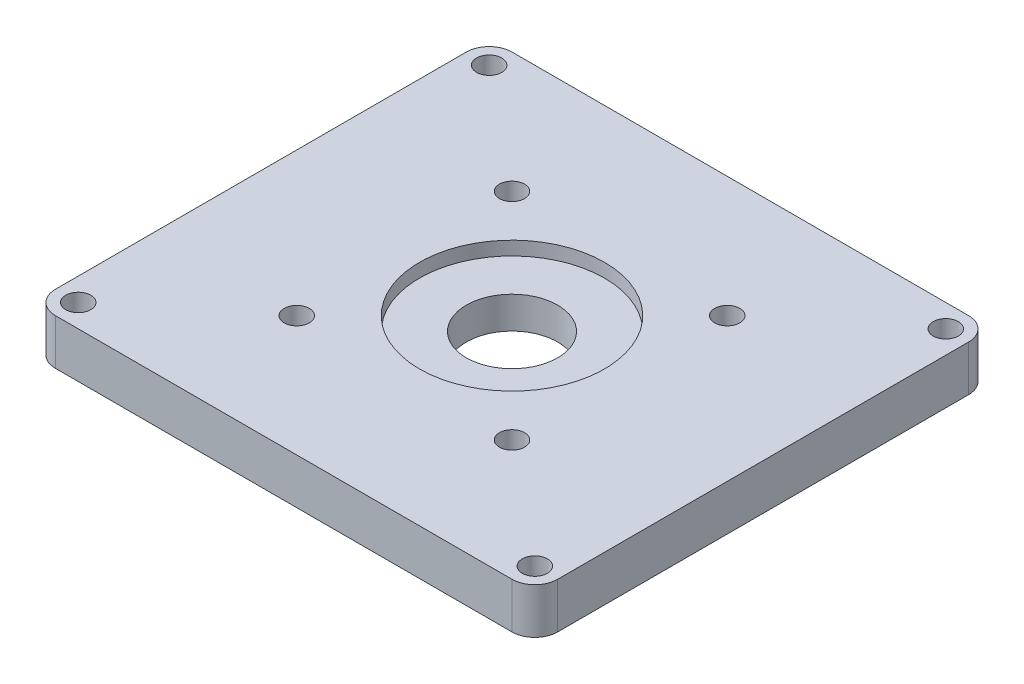
ISO-10303-21;
HEADER;
FILE_DESCRIPTION(('STEP AP214'),'2;1');
FILE_NAME('part.step','',(''),(''),'','','');
FILE_SCHEMA(('AUTOMOTIVE_DESIGN { 1 0 10303 214 1 1 1 1 }'));
ENDSEC;
DATA;
#1=APPLICATION_CONTEXT('core data for automotive mechanical design processes');
#2=APPLICATION_PROTOCOL_DEFINITION('international standard','automotive_design',2000,#1);
#3=PRODUCT_CONTEXT('',#1,'mechanical');
#4=PRODUCT('Part','Part','',(#3));
#5=PRODUCT_RELATED_PRODUCT_CATEGORY('part','',(#4));
#6=PRODUCT_DEFINITION_FORMATION('','',#4);
#7=PRODUCT_DEFINITION_CONTEXT('part definition',#1,'design');
#8=PRODUCT_DEFINITION('design','',#6,#7);
#9=PRODUCT_DEFINITION_SHAPE('','',#8);
#10=(LENGTH_UNIT() NAMED_UNIT(*) SI_UNIT(.MILLI.,.METRE.));
#11=(NAMED_UNIT(*) PLANE_ANGLE_UNIT() SI_UNIT($,.RADIAN.));
#12=(NAMED_UNIT(*) SI_UNIT($,.STERADIAN.) SOLID_ANGLE_UNIT());
#13=UNCERTAINTY_MEASURE_WITH_UNIT(LENGTH_MEASURE(1.E-05),#10,'distance_accuracy_value','');
#14=(GEOMETRIC_REPRESENTATION_CONTEXT(3) GLOBAL_UNCERTAINTY_ASSIGNED_CONTEXT((#13)) GLOBAL_UNIT_ASSIGNED_CONTEXT((#10,
#11,#12)) REPRESENTATION_CONTEXT('',''));
#15=CARTESIAN_POINT('',(0.,0.,0.));
#16=DIRECTION('',(0.,0.,1.));
#17=DIRECTION('',(1.,0.,0.));
#18=AXIS2_PLACEMENT_3D('',#15,#16,#17);
#19=CARTESIAN_POINT('',(0.,10.,0.));
#20=DIRECTION('',(0.,-1.,0.));
#21=DIRECTION('',(0.,0.,-1.));
#22=AXIS2_PLACEMENT_3D('',#19,#20,#21);
#23=CYLINDRICAL_SURFACE('',#22,2.75);
#24=CARTESIAN_POINT('',(0.,10.,0.));
#25=DIRECTION('',(0.,1.,0.));
#26=DIRECTION('',(0.,0.,1.));
#27=AXIS2_PLACEMENT_3D('',#24,#25,#26);
#28=CIRCLE('',#27,2.75);
#29=CARTESIAN_POINT('',(0.,10.,2.75));
#30=VERTEX_POINT('',#29);
#31=EDGE_CURVE('E310',#30,#30,#28,.T.);
#32=ORIENTED_EDGE('',*,*,#31,.T.);
#33=EDGE_LOOP('',(#32));
#34=FACE_BOUND('',#33,.T.);
#35=CARTESIAN_POINT('',(0.,5.5,0.));
#36=DIRECTION('',(0.,-1.,0.));
#37=DIRECTION('',(0.,0.,-1.));
#38=AXIS2_PLACEMENT_3D('',#35,#36,#37);
#39=CIRCLE('',#38,2.75);
#40=CARTESIAN_POINT('',(0.,5.5,-2.75));
#41=VERTEX_POINT('',#40);
#42=EDGE_CURVE('E168',#41,#41,#39,.T.);
#43=ORIENTED_EDGE('',*,*,#42,.T.);
#44=EDGE_LOOP('',(#43));
#45=FACE_BOUND('',#44,.T.);
#46=ADVANCED_FACE('F44',(#34,#45),#23,.F.);
#47=CARTESIAN_POINT('',(47.14,10.,-47.14));
#48=DIRECTION('',(0.,-1.,0.));
#49=DIRECTION('',(0.,0.,-1.));
#50=AXIS2_PLACEMENT_3D('',#47,#48,#49);
#51=CYLINDRICAL_SURFACE('',#50,2.75);
#52=CARTESIAN_POINT('',(47.14,10.,-47.14));
#53=DIRECTION('',(0.,1.,0.));
#54=DIRECTION('',(0.,0.,1.));
#55=AXIS2_PLACEMENT_3D('',#52,#53,#54);
#56=CIRCLE('',#55,2.75);
#57=CARTESIAN_POINT('',(47.14,10.,-44.39));
#58=VERTEX_POINT('',#57);
#59=EDGE_CURVE('E306',#58,#58,#56,.T.);
#60=ORIENTED_EDGE('',*,*,#59,.T.);
#61=EDGE_LOOP('',(#60));
#62=FACE_BOUND('',#61,.T.);
#63=CARTESIAN_POINT('',(47.14,5.5,-47.14));
#64=DIRECTION('',(0.,-1.,0.));
#65=DIRECTION('',(0.,0.,-1.));
#66=AXIS2_PLACEMENT_3D('',#63,#64,#65);
#67=CIRCLE('',#66,2.75);
#68=CARTESIAN_POINT('',(47.14,5.5,-49.89));
#69=VERTEX_POINT('',#68);
#70=EDGE_CURVE('E164',#69,#69,#67,.T.);
#71=ORIENTED_EDGE('',*,*,#70,.T.);
#72=EDGE_LOOP('',(#71));
#73=FACE_BOUND('',#72,.T.);
#74=ADVANCED_FACE('F391',(#62,#73),#51,.F.);
#75=CARTESIAN_POINT('',(0.,10.,-47.14));
#76=DIRECTION('',(0.,-1.,0.));
#77=DIRECTION('',(0.,0.,-1.));
#78=AXIS2_PLACEMENT_3D('',#75,#76,#77);
#79=CYLINDRICAL_SURFACE('',#78,2.75);
#80=CARTESIAN_POINT('',(0.,10.,-47.14));
#81=DIRECTION('',(0.,1.,0.));
#82=DIRECTION('',(0.,0.,1.));
#83=AXIS2_PLACEMENT_3D('',#80,#81,#82);
#84=CIRCLE('',#83,2.75);
#85=CARTESIAN_POINT('',(0.,10.,-44.39));
#86=VERTEX_POINT('',#85);
#87=EDGE_CURVE('E143',#86,#86,#84,.T.);
#88=ORIENTED_EDGE('',*,*,#87,.T.);
#89=EDGE_LOOP('',(#88));
#90=FACE_BOUND('',#89,.T.);
#91=CARTESIAN_POINT('',(0.,5.5,-47.14));
#92=DIRECTION('',(0.,-1.,0.));
#93=DIRECTION('',(0.,0.,-1.));
#94=AXIS2_PLACEMENT_3D('',#91,#92,#93);
#95=CIRCLE('',#94,2.75);
#96=CARTESIAN_POINT('',(0.,5.5,-49.89));
#97=VERTEX_POINT('',#96);
#98=EDGE_CURVE('E159',#97,#97,#95,.T.);
#99=ORIENTED_EDGE('',*,*,#98,.T.);
#100=EDGE_LOOP('',(#99));
#101=FACE_BOUND('',#100,.T.);
#102=ADVANCED_FACE('F343',(#90,#101),#79,.F.);
#103=CARTESIAN_POINT('',(47.14,10.,0.));
#104=DIRECTION('',(0.,-1.,0.));
#105=DIRECTION('',(0.,0.,-1.));
#106=AXIS2_PLACEMENT_3D('',#103,#104,#105);
#107=CYLINDRICAL_SURFACE('',#106,2.75);
#108=CARTESIAN_POINT('',(47.14,10.,0.));
#109=DIRECTION('',(0.,1.,0.));
#110=DIRECTION('',(0.,0.,1.));
#111=AXIS2_PLACEMENT_3D('',#108,#109,#110);
#112=CIRCLE('',#111,2.75);
#113=CARTESIAN_POINT('',(47.14,10.,2.75));
#114=VERTEX_POINT('',#113);
#115=EDGE_CURVE('E174',#114,#114,#112,.T.);
#116=ORIENTED_EDGE('',*,*,#115,.T.);
#117=EDGE_LOOP('',(#116));
#118=FACE_BOUND('',#117,.T.);
#119=CARTESIAN_POINT('',(47.14,5.5,0.));
#120=DIRECTION('',(0.,-1.,0.));
#121=DIRECTION('',(0.,0.,-1.));
#122=AXIS2_PLACEMENT_3D('',#119,#120,#121);
#123=CIRCLE('',#122,2.75);
#124=CARTESIAN_POINT('',(47.14,5.5,-2.75));
#125=VERTEX_POINT('',#124);
#126=EDGE_CURVE('E155',#125,#125,#123,.T.);
#127=ORIENTED_EDGE('',*,*,#126,.T.);
#128=EDGE_LOOP('',(#127));
#129=FACE_BOUND('',#128,.T.);
#130=ADVANCED_FACE('F339',(#118,#129),#107,.F.);
#131=CARTESIAN_POINT('',(23.57,0.,-23.57));
#132=DIRECTION('',(0.,1.,0.));
#133=DIRECTION('',(0.,0.,1.));
#134=AXIS2_PLACEMENT_3D('',#131,#132,#133);
#135=CYLINDRICAL_SURFACE('',#134,10.);
#136=CARTESIAN_POINT('',(23.57,0.,-23.57));
#137=DIRECTION('',(0.,1.,0.));
#138=DIRECTION('',(0.,0.,1.));
#139=AXIS2_PLACEMENT_3D('',#136,#137,#138);
#140=CIRCLE('',#139,10.);
#141=CARTESIAN_POINT('',(23.57,0.,-13.57));
#142=VERTEX_POINT('',#141);
#143=EDGE_CURVE('E153',#142,#142,#140,.T.);
#144=ORIENTED_EDGE('',*,*,#143,.F.);
#145=EDGE_LOOP('',(#144));
#146=FACE_BOUND('',#145,.T.);
#147=CARTESIAN_POINT('',(23.57,7.,-23.57));
#148=DIRECTION('',(0.,1.,0.));
#149=DIRECTION('',(0.,0.,1.));
#150=AXIS2_PLACEMENT_3D('',#147,#148,#149);
#151=CIRCLE('',#150,10.);
#152=CARTESIAN_POINT('',(23.57,7.,-13.57));
#153=VERTEX_POINT('',#152);
#154=EDGE_CURVE('E149',#153,#153,#151,.F.);
#155=ORIENTED_EDGE('',*,*,#154,.F.);
#156=EDGE_LOOP('',(#155));
#157=FACE_BOUND('',#156,.T.);
#158=ADVANCED_FACE('F342',(#146,#157),#135,.F.);
#159=CARTESIAN_POINT('',(78.57,10.,0.));
#160=DIRECTION('',(1.,0.,0.));
#161=DIRECTION('',(0.,0.,-1.));
#162=AXIS2_PLACEMENT_3D('',#159,#160,#161);
#163=PLANE('',#162);
#164=DIRECTION('',(0.,0.,1.));
#165=VECTOR('',#164,1.);
#166=CARTESIAN_POINT('',(78.57,0.,0.));
#167=LINE('',#166,#165);
#168=CARTESIAN_POINT('',(78.57,0.,-68.57));
#169=VERTEX_POINT('',#168);
#170=CARTESIAN_POINT('',(78.57,0.,21.43));
#171=VERTEX_POINT('',#170);
#172=EDGE_CURVE('E145',#169,#171,#167,.T.);
#173=ORIENTED_EDGE('',*,*,#172,.F.);
#174=DIRECTION('',(0.,-1.,0.));
#175=VECTOR('',#174,1.);
#176=CARTESIAN_POINT('',(78.57,10.,-68.57));
#177=LINE('',#176,#175);
#178=CARTESIAN_POINT('',(78.57,10.,-68.57));
#179=VERTEX_POINT('',#178);
#180=EDGE_CURVE('E203',#169,#179,#177,.F.);
#181=ORIENTED_EDGE('',*,*,#180,.T.);
#182=DIRECTION('',(0.,0.,1.));
#183=VECTOR('',#182,1.);
#184=CARTESIAN_POINT('',(78.57,10.,0.));
#185=LINE('',#184,#183);
#186=CARTESIAN_POINT('',(78.57,10.,21.43));
#187=VERTEX_POINT('',#186);
#188=EDGE_CURVE('E222',#179,#187,#185,.T.);
#189=ORIENTED_EDGE('',*,*,#188,.T.);
#190=DIRECTION('',(0.,-1.,0.));
#191=VECTOR('',#190,1.);
#192=CARTESIAN_POINT('',(78.57,0.,21.43));
#193=LINE('',#192,#191);
#194=EDGE_CURVE('E199',#187,#171,#193,.T.);
#195=ORIENTED_EDGE('',*,*,#194,.T.);
#196=EDGE_LOOP('',(#173,#181,#189,#195));
#197=FACE_BOUND('',#196,.T.);
#198=ADVANCED_FACE('F219',(#197),#163,.T.);
#199=CARTESIAN_POINT('',(0.,10.,-73.57));
#200=DIRECTION('',(0.,0.,-1.));
#201=DIRECTION('',(-1.,0.,0.));
#202=AXIS2_PLACEMENT_3D('',#199,#200,#201);
#203=PLANE('',#202);
#204=DIRECTION('',(1.,0.,0.));
#205=VECTOR('',#204,1.);
#206=CARTESIAN_POINT('',(0.,0.,-73.57));
#207=LINE('',#206,#205);
#208=CARTESIAN_POINT('',(-26.43,0.,-73.57));
#209=VERTEX_POINT('',#208);
#210=CARTESIAN_POINT('',(73.57,0.,-73.57));
#211=VERTEX_POINT('',#210);
#212=EDGE_CURVE('E139',#209,#211,#207,.T.);
#213=ORIENTED_EDGE('',*,*,#212,.F.);
#214=DIRECTION('',(0.,-1.,0.));
#215=VECTOR('',#214,1.);
#216=CARTESIAN_POINT('',(-26.43,10.,-73.57));
#217=LINE('',#216,#215);
#218=CARTESIAN_POINT('',(-26.43,10.,-73.57));
#219=VERTEX_POINT('',#218);
#220=EDGE_CURVE('E115',#209,#219,#217,.F.);
#221=ORIENTED_EDGE('',*,*,#220,.T.);
#222=DIRECTION('',(1.,0.,0.));
#223=VECTOR('',#222,1.);
#224=CARTESIAN_POINT('',(0.,10.,-73.57));
#225=LINE('',#224,#223);
#226=CARTESIAN_POINT('',(73.57,10.,-73.57));
#227=VERTEX_POINT('',#226);
#228=EDGE_CURVE('E225',#219,#227,#225,.T.);
#229=ORIENTED_EDGE('',*,*,#228,.T.);
#230=DIRECTION('',(0.,-1.,0.));
#231=VECTOR('',#230,1.);
#232=CARTESIAN_POINT('',(73.57,10.,-73.57));
#233=LINE('',#232,#231);
#234=EDGE_CURVE('E121',#227,#211,#233,.T.);
#235=ORIENTED_EDGE('',*,*,#234,.T.);
#236=EDGE_LOOP('',(#213,#221,#229,#235));
#237=FACE_BOUND('',#236,.T.);
#238=ADVANCED_FACE('F577',(#237),#203,.T.);
#239=CARTESIAN_POINT('',(-31.43,10.,0.));
#240=DIRECTION('',(1.,0.,0.));
#241=DIRECTION('',(0.,0.,-1.));
#242=AXIS2_PLACEMENT_3D('',#239,#240,#241);
#243=PLANE('',#242);
#244=DIRECTION('',(0.,0.,1.));
#245=VECTOR('',#244,1.);
#246=CARTESIAN_POINT('',(-31.43,10.,0.));
#247=LINE('',#246,#245);
#248=CARTESIAN_POINT('',(-31.43,10.,-68.57));
#249=VERTEX_POINT('',#248);
#250=CARTESIAN_POINT('',(-31.43,10.,21.43));
#251=VERTEX_POINT('',#250);
#252=EDGE_CURVE('E130',#249,#251,#247,.T.);
#253=ORIENTED_EDGE('',*,*,#252,.F.);
#254=DIRECTION('',(0.,-1.,0.));
#255=VECTOR('',#254,1.);
#256=CARTESIAN_POINT('',(-31.43,0.,-68.57));
#257=LINE('',#256,#255);
#258=CARTESIAN_POINT('',(-31.43,0.,-68.57));
#259=VERTEX_POINT('',#258);
#260=EDGE_CURVE('E114',#249,#259,#257,.T.);
#261=ORIENTED_EDGE('',*,*,#260,.T.);
#262=DIRECTION('',(0.,0.,1.));
#263=VECTOR('',#262,1.);
#264=CARTESIAN_POINT('',(-31.43,0.,0.));
#265=LINE('',#264,#263);
#266=CARTESIAN_POINT('',(-31.43,0.,21.43));
#267=VERTEX_POINT('',#266);
#268=EDGE_CURVE('E128',#259,#267,#265,.T.);
#269=ORIENTED_EDGE('',*,*,#268,.T.);
#270=DIRECTION('',(0.,-1.,0.));
#271=VECTOR('',#270,1.);
#272=CARTESIAN_POINT('',(-31.43,10.,21.43));
#273=LINE('',#272,#271);
#274=EDGE_CURVE('E133',#267,#251,#273,.F.);
#275=ORIENTED_EDGE('',*,*,#274,.T.);
#276=EDGE_LOOP('',(#253,#261,#269,#275));
#277=FACE_BOUND('',#276,.T.);
#278=ADVANCED_FACE('F127',(#277),#243,.F.);
#279=CARTESIAN_POINT('',(0.,10.,26.43));
#280=DIRECTION('',(0.,0.,-1.));
#281=DIRECTION('',(-1.,0.,0.));
#282=AXIS2_PLACEMENT_3D('',#279,#280,#281);
#283=PLANE('',#282);
#284=DIRECTION('',(1.,0.,0.));
#285=VECTOR('',#284,1.);
#286=CARTESIAN_POINT('',(0.,0.,26.43));
#287=LINE('',#286,#285);
#288=CARTESIAN_POINT('',(-26.43,0.,26.43));
#289=VERTEX_POINT('',#288);
#290=CARTESIAN_POINT('',(73.57,0.,26.43));
#291=VERTEX_POINT('',#290);
#292=EDGE_CURVE('E138',#289,#291,#287,.T.);
#293=ORIENTED_EDGE('',*,*,#292,.T.);
#294=DIRECTION('',(0.,-1.,0.));
#295=VECTOR('',#294,1.);
#296=CARTESIAN_POINT('',(73.57,10.,26.43));
#297=LINE('',#296,#295);
#298=CARTESIAN_POINT('',(73.57,10.,26.43));
#299=VERTEX_POINT('',#298);
#300=EDGE_CURVE('E11',#291,#299,#297,.F.);
#301=ORIENTED_EDGE('',*,*,#300,.T.);
#302=DIRECTION('',(1.,0.,0.));
#303=VECTOR('',#302,1.);
#304=CARTESIAN_POINT('',(0.,10.,26.43));
#305=LINE('',#304,#303);
#306=CARTESIAN_POINT('',(-26.43,10.,26.43));
#307=VERTEX_POINT('',#306);
#308=EDGE_CURVE('E209',#307,#299,#305,.T.);
#309=ORIENTED_EDGE('',*,*,#308,.F.);
#310=DIRECTION('',(0.,-1.,0.));
#311=VECTOR('',#310,1.);
#312=CARTESIAN_POINT('',(-26.43,10.,26.43));
#313=LINE('',#312,#311);
#314=EDGE_CURVE('E53',#307,#289,#313,.T.);
#315=ORIENTED_EDGE('',*,*,#314,.T.);
#316=EDGE_LOOP('',(#293,#301,#309,#315));
#317=FACE_BOUND('',#316,.T.);
#318=ADVANCED_FACE('F208',(#317),#283,.F.);
#319=CARTESIAN_POINT('',(-26.43,10.,-68.57));
#320=DIRECTION('',(0.,-1.,0.));
#321=DIRECTION('',(0.,0.,-1.));
#322=AXIS2_PLACEMENT_3D('',#319,#320,#321);
#323=CYLINDRICAL_SURFACE('',#322,2.75);
#324=CARTESIAN_POINT('',(-26.43,10.,-68.57));
#325=DIRECTION('',(0.,1.,0.));
#326=DIRECTION('',(0.,0.,1.));
#327=AXIS2_PLACEMENT_3D('',#324,#325,#326);
#328=CIRCLE('',#327,2.75);
#329=CARTESIAN_POINT('',(-26.43,10.,-65.82));
#330=VERTEX_POINT('',#329);
#331=EDGE_CURVE('E226',#330,#330,#328,.T.);
#332=ORIENTED_EDGE('',*,*,#331,.T.);
#333=EDGE_LOOP('',(#332));
#334=FACE_BOUND('',#333,.T.);
#335=CARTESIAN_POINT('',(-26.43,0.,-68.57));
#336=DIRECTION('',(0.,1.,0.));
#337=DIRECTION('',(0.,0.,1.));
#338=AXIS2_PLACEMENT_3D('',#335,#336,#337);
#339=CIRCLE('',#338,2.75);
#340=CARTESIAN_POINT('',(-26.43,0.,-65.82));
#341=VERTEX_POINT('',#340);
#342=EDGE_CURVE('E256',#341,#341,#339,.T.);
#343=ORIENTED_EDGE('',*,*,#342,.F.);
#344=EDGE_LOOP('',(#343));
#345=FACE_BOUND('',#344,.T.);
#346=ADVANCED_FACE('F378',(#334,#345),#323,.F.);
#347=CARTESIAN_POINT('',(73.57,10.,21.43));
#348=DIRECTION('',(0.,-1.,0.));
#349=DIRECTION('',(0.,0.,-1.));
#350=AXIS2_PLACEMENT_3D('',#347,#348,#349);
#351=CYLINDRICAL_SURFACE('',#350,2.75000000000001);
#352=CARTESIAN_POINT('',(73.57,10.,21.43));
#353=DIRECTION('',(0.,1.,0.));
#354=DIRECTION('',(0.,0.,1.));
#355=AXIS2_PLACEMENT_3D('',#352,#353,#354);
#356=CIRCLE('',#355,2.75000000000001);
#357=CARTESIAN_POINT('',(73.57,10.,24.18));
#358=VERTEX_POINT('',#357);
#359=EDGE_CURVE('E233',#358,#358,#356,.T.);
#360=ORIENTED_EDGE('',*,*,#359,.T.);
#361=EDGE_LOOP('',(#360));
#362=FACE_BOUND('',#361,.T.);
#363=CARTESIAN_POINT('',(73.57,0.,21.43));
#364=DIRECTION('',(0.,1.,0.));
#365=DIRECTION('',(0.,0.,1.));
#366=AXIS2_PLACEMENT_3D('',#363,#364,#365);
#367=CIRCLE('',#366,2.75000000000001);
#368=CARTESIAN_POINT('',(73.57,0.,24.18));
#369=VERTEX_POINT('',#368);
#370=EDGE_CURVE('E252',#369,#369,#367,.T.);
#371=ORIENTED_EDGE('',*,*,#370,.F.);
#372=EDGE_LOOP('',(#371));
#373=FACE_BOUND('',#372,.T.);
#374=ADVANCED_FACE('F325',(#362,#373),#351,.F.);
#375=CARTESIAN_POINT('',(73.57,10.,-68.57));
#376=DIRECTION('',(0.,-1.,0.));
#377=DIRECTION('',(0.,0.,-1.));
#378=AXIS2_PLACEMENT_3D('',#375,#376,#377);
#379=CYLINDRICAL_SURFACE('',#378,2.75000000000001);
#380=CARTESIAN_POINT('',(73.57,10.,-68.57));
#381=DIRECTION('',(0.,1.,0.));
#382=DIRECTION('',(0.,0.,1.));
#383=AXIS2_PLACEMENT_3D('',#380,#381,#382);
#384=CIRCLE('',#383,2.75000000000001);
#385=CARTESIAN_POINT('',(73.57,10.,-65.82));
#386=VERTEX_POINT('',#385);
#387=EDGE_CURVE('E318',#386,#386,#384,.T.);
#388=ORIENTED_EDGE('',*,*,#387,.T.);
#389=EDGE_LOOP('',(#388));
#390=FACE_BOUND('',#389,.T.);
#391=CARTESIAN_POINT('',(73.57,0.,-68.57));
#392=DIRECTION('',(0.,1.,0.));
#393=DIRECTION('',(0.,0.,1.));
#394=AXIS2_PLACEMENT_3D('',#391,#392,#393);
#395=CIRCLE('',#394,2.75000000000001);
#396=CARTESIAN_POINT('',(73.57,0.,-65.82));
#397=VERTEX_POINT('',#396);
#398=EDGE_CURVE('E248',#397,#397,#395,.T.);
#399=ORIENTED_EDGE('',*,*,#398,.F.);
#400=EDGE_LOOP('',(#399));
#401=FACE_BOUND('',#400,.T.);
#402=ADVANCED_FACE('F385',(#390,#401),#379,.F.);
#403=CARTESIAN_POINT('',(-26.43,10.,21.43));
#404=DIRECTION('',(0.,-1.,0.));
#405=DIRECTION('',(0.,0.,-1.));
#406=AXIS2_PLACEMENT_3D('',#403,#404,#405);
#407=CYLINDRICAL_SURFACE('',#406,2.75);
#408=CARTESIAN_POINT('',(-26.43,10.,21.43));
#409=DIRECTION('',(0.,1.,0.));
#410=DIRECTION('',(0.,0.,1.));
#411=AXIS2_PLACEMENT_3D('',#408,#409,#410);
#412=CIRCLE('',#411,2.75);
#413=CARTESIAN_POINT('',(-26.43,10.,24.18));
#414=VERTEX_POINT('',#413);
#415=EDGE_CURVE('E314',#414,#414,#412,.T.);
#416=ORIENTED_EDGE('',*,*,#415,.T.);
#417=EDGE_LOOP('',(#416));
#418=FACE_BOUND('',#417,.T.);
#419=CARTESIAN_POINT('',(-26.43,0.,21.43));
#420=DIRECTION('',(0.,1.,0.));
#421=DIRECTION('',(0.,0.,1.));
#422=AXIS2_PLACEMENT_3D('',#419,#420,#421);
#423=CIRCLE('',#422,2.75);
#424=CARTESIAN_POINT('',(-26.43,0.,24.18));
#425=VERTEX_POINT('',#424);
#426=EDGE_CURVE('E244',#425,#425,#423,.T.);
#427=ORIENTED_EDGE('',*,*,#426,.F.);
#428=EDGE_LOOP('',(#427));
#429=FACE_BOUND('',#428,.T.);
#430=ADVANCED_FACE('F331',(#418,#429),#407,.F.);
#431=CARTESIAN_POINT('',(0.,10.,0.));
#432=DIRECTION('',(0.,1.,0.));
#433=DIRECTION('',(0.,0.,1.));
#434=AXIS2_PLACEMENT_3D('',#431,#432,#433);
#435=PLANE('',#434);
#436=CARTESIAN_POINT('',(23.57,10.,-23.57));
#437=DIRECTION('',(0.,1.,0.));
#438=DIRECTION('',(0.,0.,1.));
#439=AXIS2_PLACEMENT_3D('',#436,#437,#438);
#440=CIRCLE('',#439,20.25);
#441=CARTESIAN_POINT('',(23.57,10.,-3.32000000000001));
#442=VERTEX_POINT('',#441);
#443=EDGE_CURVE('E172',#442,#442,#440,.T.);
#444=ORIENTED_EDGE('',*,*,#443,.F.);
#445=EDGE_LOOP('',(#444));
#446=FACE_BOUND('',#445,.T.);
#447=ORIENTED_EDGE('',*,*,#87,.F.);
#448=EDGE_LOOP('',(#447));
#449=FACE_BOUND('',#448,.T.);
#450=ORIENTED_EDGE('',*,*,#59,.F.);
#451=EDGE_LOOP('',(#450));
#452=FACE_BOUND('',#451,.T.);
#453=ORIENTED_EDGE('',*,*,#31,.F.);
#454=EDGE_LOOP('',(#453));
#455=FACE_BOUND('',#454,.T.);
#456=ORIENTED_EDGE('',*,*,#415,.F.);
#457=EDGE_LOOP('',(#456));
#458=FACE_BOUND('',#457,.T.);
#459=ORIENTED_EDGE('',*,*,#387,.F.);
#460=EDGE_LOOP('',(#459));
#461=FACE_BOUND('',#460,.T.);
#462=ORIENTED_EDGE('',*,*,#359,.F.);
#463=EDGE_LOOP('',(#462));
#464=FACE_BOUND('',#463,.T.);
#465=ORIENTED_EDGE('',*,*,#331,.F.);
#466=EDGE_LOOP('',(#465));
#467=FACE_BOUND('',#466,.T.);
#468=ORIENTED_EDGE('',*,*,#228,.F.);
#469=CARTESIAN_POINT('',(-26.43,10.,-68.57));
#470=DIRECTION('',(0.,1.,0.));
#471=DIRECTION('',(0.,0.,1.));
#472=AXIS2_PLACEMENT_3D('',#469,#470,#471);
#473=CIRCLE('',#472,5.);
#474=EDGE_CURVE('E196',#219,#249,#473,.T.);
#475=ORIENTED_EDGE('',*,*,#474,.T.);
#476=ORIENTED_EDGE('',*,*,#252,.T.);
#477=CARTESIAN_POINT('',(-26.43,10.,21.43));
#478=DIRECTION('',(0.,1.,0.));
#479=DIRECTION('',(0.,0.,1.));
#480=AXIS2_PLACEMENT_3D('',#477,#478,#479);
#481=CIRCLE('',#480,5.);
#482=EDGE_CURVE('E65',#251,#307,#481,.T.);
#483=ORIENTED_EDGE('',*,*,#482,.T.);
#484=ORIENTED_EDGE('',*,*,#308,.T.);
#485=CARTESIAN_POINT('',(73.57,10.,21.43));
#486=DIRECTION('',(0.,1.,0.));
#487=DIRECTION('',(0.,0.,1.));
#488=AXIS2_PLACEMENT_3D('',#485,#486,#487);
#489=CIRCLE('',#488,5.);
#490=EDGE_CURVE('E190',#299,#187,#489,.T.);
#491=ORIENTED_EDGE('',*,*,#490,.T.);
#492=ORIENTED_EDGE('',*,*,#188,.F.);
#493=CARTESIAN_POINT('',(73.57,10.,-68.57));
#494=DIRECTION('',(0.,1.,0.));
#495=DIRECTION('',(0.,0.,1.));
#496=AXIS2_PLACEMENT_3D('',#493,#494,#495);
#497=CIRCLE('',#496,5.);
#498=EDGE_CURVE('E193',#179,#227,#497,.T.);
#499=ORIENTED_EDGE('',*,*,#498,.T.);
#500=EDGE_LOOP('',(#468,#475,#476,#483,#484,#491,#492,#499));
#501=FACE_BOUND('',#500,.T.);
#502=ORIENTED_EDGE('',*,*,#115,.F.);
#503=EDGE_LOOP('',(#502));
#504=FACE_BOUND('',#503,.T.);
#505=ADVANCED_FACE('F328',(#446,#449,#452,#455,#458,#461,#464,#467,#501,#504),#435,.T.);
#506=CARTESIAN_POINT('',(0.,0.,0.));
#507=DIRECTION('',(0.,1.,0.));
#508=DIRECTION('',(0.,0.,1.));
#509=AXIS2_PLACEMENT_3D('',#506,#507,#508);
#510=PLANE('',#509);
#511=CARTESIAN_POINT('',(0.,0.,-47.14));
#512=DIRECTION('',(0.,-1.,0.));
#513=DIRECTION('',(0.,0.,-1.));
#514=AXIS2_PLACEMENT_3D('',#511,#512,#513);
#515=CIRCLE('',#514,6.25);
#516=CARTESIAN_POINT('',(0.,0.,-53.39));
#517=VERTEX_POINT('',#516);
#518=EDGE_CURVE('E292',#517,#517,#515,.T.);
#519=ORIENTED_EDGE('',*,*,#518,.F.);
#520=EDGE_LOOP('',(#519));
#521=FACE_BOUND('',#520,.T.);
#522=CARTESIAN_POINT('',(47.14,0.,-47.14));
#523=DIRECTION('',(0.,-1.,0.));
#524=DIRECTION('',(0.,0.,-1.));
#525=AXIS2_PLACEMENT_3D('',#522,#523,#524);
#526=CIRCLE('',#525,6.25);
#527=CARTESIAN_POINT('',(47.14,0.,-53.39));
#528=VERTEX_POINT('',#527);
#529=EDGE_CURVE('E284',#528,#528,#526,.T.);
#530=ORIENTED_EDGE('',*,*,#529,.F.);
#531=EDGE_LOOP('',(#530));
#532=FACE_BOUND('',#531,.T.);
#533=CARTESIAN_POINT('',(47.14,0.,0.));
#534=DIRECTION('',(0.,-1.,0.));
#535=DIRECTION('',(0.,0.,-1.));
#536=AXIS2_PLACEMENT_3D('',#533,#534,#535);
#537=CIRCLE('',#536,6.25);
#538=CARTESIAN_POINT('',(47.14,0.,-6.25));
#539=VERTEX_POINT('',#538);
#540=EDGE_CURVE('E276',#539,#539,#537,.T.);
#541=ORIENTED_EDGE('',*,*,#540,.F.);
#542=EDGE_LOOP('',(#541));
#543=FACE_BOUND('',#542,.T.);
#544=CARTESIAN_POINT('',(0.,0.,0.));
#545=DIRECTION('',(0.,-1.,0.));
#546=DIRECTION('',(0.,0.,-1.));
#547=AXIS2_PLACEMENT_3D('',#544,#545,#546);
#548=CIRCLE('',#547,6.25);
#549=CARTESIAN_POINT('',(0.,0.,-6.25));
#550=VERTEX_POINT('',#549);
#551=EDGE_CURVE('E272',#550,#550,#548,.T.);
#552=ORIENTED_EDGE('',*,*,#551,.F.);
#553=EDGE_LOOP('',(#552));
#554=FACE_BOUND('',#553,.T.);
#555=ORIENTED_EDGE('',*,*,#143,.T.);
#556=EDGE_LOOP('',(#555));
#557=FACE_BOUND('',#556,.T.);
#558=ORIENTED_EDGE('',*,*,#426,.T.);
#559=EDGE_LOOP('',(#558));
#560=FACE_BOUND('',#559,.T.);
#561=ORIENTED_EDGE('',*,*,#398,.T.);
#562=EDGE_LOOP('',(#561));
#563=FACE_BOUND('',#562,.T.);
#564=ORIENTED_EDGE('',*,*,#370,.T.);
#565=EDGE_LOOP('',(#564));
#566=FACE_BOUND('',#565,.T.);
#567=ORIENTED_EDGE('',*,*,#342,.T.);
#568=EDGE_LOOP('',(#567));
#569=FACE_BOUND('',#568,.T.);
#570=ORIENTED_EDGE('',*,*,#268,.F.);
#571=CARTESIAN_POINT('',(-26.43,0.,-68.57));
#572=DIRECTION('',(0.,1.,0.));
#573=DIRECTION('',(0.,0.,1.));
#574=AXIS2_PLACEMENT_3D('',#571,#572,#573);
#575=CIRCLE('',#574,5.);
#576=EDGE_CURVE('E110',#259,#209,#575,.F.);
#577=ORIENTED_EDGE('',*,*,#576,.T.);
#578=ORIENTED_EDGE('',*,*,#212,.T.);
#579=CARTESIAN_POINT('',(73.57,0.,-68.57));
#580=DIRECTION('',(0.,1.,0.));
#581=DIRECTION('',(0.,0.,1.));
#582=AXIS2_PLACEMENT_3D('',#579,#580,#581);
#583=CIRCLE('',#582,5.);
#584=EDGE_CURVE('E122',#211,#169,#583,.F.);
#585=ORIENTED_EDGE('',*,*,#584,.T.);
#586=ORIENTED_EDGE('',*,*,#172,.T.);
#587=CARTESIAN_POINT('',(73.57,0.,21.43));
#588=DIRECTION('',(0.,1.,0.));
#589=DIRECTION('',(0.,0.,1.));
#590=AXIS2_PLACEMENT_3D('',#587,#588,#589);
#591=CIRCLE('',#590,5.);
#592=EDGE_CURVE('E178',#171,#291,#591,.F.);
#593=ORIENTED_EDGE('',*,*,#592,.T.);
#594=ORIENTED_EDGE('',*,*,#292,.F.);
#595=CARTESIAN_POINT('',(-26.43,0.,21.43));
#596=DIRECTION('',(0.,1.,0.));
#597=DIRECTION('',(0.,0.,1.));
#598=AXIS2_PLACEMENT_3D('',#595,#596,#597);
#599=CIRCLE('',#598,5.);
#600=EDGE_CURVE('E132',#289,#267,#599,.F.);
#601=ORIENTED_EDGE('',*,*,#600,.T.);
#602=EDGE_LOOP('',(#570,#577,#578,#585,#586,#593,#594,#601));
#603=FACE_BOUND('',#602,.T.);
#604=ADVANCED_FACE('F135',(#521,#532,#543,#554,#557,#560,#563,#566,#569,#603),#510,.F.);
#605=CARTESIAN_POINT('',(23.57,7.,-23.57));
#606=DIRECTION('',(0.,1.,0.));
#607=DIRECTION('',(0.,0.,1.));
#608=AXIS2_PLACEMENT_3D('',#605,#606,#607);
#609=PLANE('',#608);
#610=CARTESIAN_POINT('',(23.57,7.,-23.57));
#611=DIRECTION('',(0.,1.,0.));
#612=DIRECTION('',(0.,0.,1.));
#613=AXIS2_PLACEMENT_3D('',#610,#611,#612);
#614=CIRCLE('',#613,20.25);
#615=CARTESIAN_POINT('',(23.57,7.,-3.32000000000001));
#616=VERTEX_POINT('',#615);
#617=EDGE_CURVE('E154',#616,#616,#614,.T.);
#618=ORIENTED_EDGE('',*,*,#617,.T.);
#619=EDGE_LOOP('',(#618));
#620=FACE_BOUND('',#619,.T.);
#621=ORIENTED_EDGE('',*,*,#154,.T.);
#622=EDGE_LOOP('',(#621));
#623=FACE_BOUND('',#622,.T.);
#624=ADVANCED_FACE('F363',(#620,#623),#609,.T.);
#625=CARTESIAN_POINT('',(23.57,7.,-23.57));
#626=DIRECTION('',(0.,1.,0.));
#627=DIRECTION('',(0.,0.,1.));
#628=AXIS2_PLACEMENT_3D('',#625,#626,#627);
#629=CYLINDRICAL_SURFACE('',#628,20.25);
#630=ORIENTED_EDGE('',*,*,#617,.F.);
#631=EDGE_LOOP('',(#630));
#632=FACE_BOUND('',#631,.T.);
#633=ORIENTED_EDGE('',*,*,#443,.T.);
#634=EDGE_LOOP('',(#633));
#635=FACE_BOUND('',#634,.T.);
#636=ADVANCED_FACE('F506',(#632,#635),#629,.F.);
#637=CARTESIAN_POINT('',(0.,5.5,0.));
#638=DIRECTION('',(0.,-1.,0.));
#639=DIRECTION('',(0.,0.,-1.));
#640=AXIS2_PLACEMENT_3D('',#637,#638,#639);
#641=CYLINDRICAL_SURFACE('',#640,6.25);
#642=CARTESIAN_POINT('',(0.,5.5,0.));
#643=DIRECTION('',(0.,-1.,0.));
#644=DIRECTION('',(0.,0.,-1.));
#645=AXIS2_PLACEMENT_3D('',#642,#643,#644);
#646=CIRCLE('',#645,6.25);
#647=CARTESIAN_POINT('',(0.,5.5,-6.25));
#648=VERTEX_POINT('',#647);
#649=EDGE_CURVE('E160',#648,#648,#646,.T.);
#650=ORIENTED_EDGE('',*,*,#649,.F.);
#651=EDGE_LOOP('',(#650));
#652=FACE_BOUND('',#651,.T.);
#653=ORIENTED_EDGE('',*,*,#551,.T.);
#654=EDGE_LOOP('',(#653));
#655=FACE_BOUND('',#654,.T.);
#656=ADVANCED_FACE('F496',(#652,#655),#641,.F.);
#657=CARTESIAN_POINT('',(0.,5.5,0.));
#658=DIRECTION('',(0.,-1.,0.));
#659=DIRECTION('',(0.,0.,-1.));
#660=AXIS2_PLACEMENT_3D('',#657,#658,#659);
#661=PLANE('',#660);
#662=ORIENTED_EDGE('',*,*,#42,.F.);
#663=EDGE_LOOP('',(#662));
#664=FACE_BOUND('',#663,.T.);
#665=ORIENTED_EDGE('',*,*,#649,.T.);
#666=EDGE_LOOP('',(#665));
#667=FACE_BOUND('',#666,.T.);
#668=ADVANCED_FACE('F357',(#664,#667),#661,.T.);
#669=CARTESIAN_POINT('',(47.14,5.5,0.));
#670=DIRECTION('',(0.,-1.,0.));
#671=DIRECTION('',(0.,0.,-1.));
#672=AXIS2_PLACEMENT_3D('',#669,#670,#671);
#673=CYLINDRICAL_SURFACE('',#672,6.25);
#674=CARTESIAN_POINT('',(47.14,5.5,0.));
#675=DIRECTION('',(0.,-1.,0.));
#676=DIRECTION('',(0.,0.,-1.));
#677=AXIS2_PLACEMENT_3D('',#674,#675,#676);
#678=CIRCLE('',#677,6.25);
#679=CARTESIAN_POINT('',(47.14,5.5,-6.25));
#680=VERTEX_POINT('',#679);
#681=EDGE_CURVE('E280',#680,#680,#678,.T.);
#682=ORIENTED_EDGE('',*,*,#681,.F.);
#683=EDGE_LOOP('',(#682));
#684=FACE_BOUND('',#683,.T.);
#685=ORIENTED_EDGE('',*,*,#540,.T.);
#686=EDGE_LOOP('',(#685));
#687=FACE_BOUND('',#686,.T.);
#688=ADVANCED_FACE('F351',(#684,#687),#673,.F.);
#689=CARTESIAN_POINT('',(47.14,5.5,0.));
#690=DIRECTION('',(0.,-1.,0.));
#691=DIRECTION('',(0.,0.,-1.));
#692=AXIS2_PLACEMENT_3D('',#689,#690,#691);
#693=PLANE('',#692);
#694=ORIENTED_EDGE('',*,*,#126,.F.);
#695=EDGE_LOOP('',(#694));
#696=FACE_BOUND('',#695,.T.);
#697=ORIENTED_EDGE('',*,*,#681,.T.);
#698=EDGE_LOOP('',(#697));
#699=FACE_BOUND('',#698,.T.);
#700=ADVANCED_FACE('F347',(#696,#699),#693,.T.);
#701=CARTESIAN_POINT('',(47.14,5.5,-47.14));
#702=DIRECTION('',(0.,-1.,0.));
#703=DIRECTION('',(0.,0.,-1.));
#704=AXIS2_PLACEMENT_3D('',#701,#702,#703);
#705=CYLINDRICAL_SURFACE('',#704,6.25);
#706=CARTESIAN_POINT('',(47.14,5.5,-47.14));
#707=DIRECTION('',(0.,-1.,0.));
#708=DIRECTION('',(0.,0.,-1.));
#709=AXIS2_PLACEMENT_3D('',#706,#707,#708);
#710=CIRCLE('',#709,6.25);
#711=CARTESIAN_POINT('',(47.14,5.5,-53.39));
#712=VERTEX_POINT('',#711);
#713=EDGE_CURVE('E288',#712,#712,#710,.T.);
#714=ORIENTED_EDGE('',*,*,#713,.F.);
#715=EDGE_LOOP('',(#714));
#716=FACE_BOUND('',#715,.T.);
#717=ORIENTED_EDGE('',*,*,#529,.T.);
#718=EDGE_LOOP('',(#717));
#719=FACE_BOUND('',#718,.T.);
#720=ADVANCED_FACE('F350',(#716,#719),#705,.F.);
#721=CARTESIAN_POINT('',(47.14,5.5,-47.14));
#722=DIRECTION('',(0.,-1.,0.));
#723=DIRECTION('',(0.,0.,-1.));
#724=AXIS2_PLACEMENT_3D('',#721,#722,#723);
#725=PLANE('',#724);
#726=ORIENTED_EDGE('',*,*,#70,.F.);
#727=EDGE_LOOP('',(#726));
#728=FACE_BOUND('',#727,.T.);
#729=ORIENTED_EDGE('',*,*,#713,.T.);
#730=EDGE_LOOP('',(#729));
#731=FACE_BOUND('',#730,.T.);
#732=ADVANCED_FACE('F456',(#728,#731),#725,.T.);
#733=CARTESIAN_POINT('',(0.,5.5,-47.14));
#734=DIRECTION('',(0.,-1.,0.));
#735=DIRECTION('',(0.,0.,-1.));
#736=AXIS2_PLACEMENT_3D('',#733,#734,#735);
#737=CYLINDRICAL_SURFACE('',#736,6.25);
#738=CARTESIAN_POINT('',(0.,5.5,-47.14));
#739=DIRECTION('',(0.,-1.,0.));
#740=DIRECTION('',(0.,0.,-1.));
#741=AXIS2_PLACEMENT_3D('',#738,#739,#740);
#742=CIRCLE('',#741,6.25);
#743=CARTESIAN_POINT('',(0.,5.5,-53.39));
#744=VERTEX_POINT('',#743);
#745=EDGE_CURVE('E296',#744,#744,#742,.T.);
#746=ORIENTED_EDGE('',*,*,#745,.F.);
#747=EDGE_LOOP('',(#746));
#748=FACE_BOUND('',#747,.T.);
#749=ORIENTED_EDGE('',*,*,#518,.T.);
#750=EDGE_LOOP('',(#749));
#751=FACE_BOUND('',#750,.T.);
#752=ADVANCED_FACE('F445',(#748,#751),#737,.F.);
#753=CARTESIAN_POINT('',(0.,5.5,-47.14));
#754=DIRECTION('',(0.,-1.,0.));
#755=DIRECTION('',(0.,0.,-1.));
#756=AXIS2_PLACEMENT_3D('',#753,#754,#755);
#757=PLANE('',#756);
#758=ORIENTED_EDGE('',*,*,#98,.F.);
#759=EDGE_LOOP('',(#758));
#760=FACE_BOUND('',#759,.T.);
#761=ORIENTED_EDGE('',*,*,#745,.T.);
#762=EDGE_LOOP('',(#761));
#763=FACE_BOUND('',#762,.T.);
#764=ADVANCED_FACE('F410',(#760,#763),#757,.T.);
#765=CARTESIAN_POINT('',(-26.43,10.,-68.57));
#766=DIRECTION('',(0.,1.,0.));
#767=DIRECTION('',(0.,0.,1.));
#768=AXIS2_PLACEMENT_3D('',#765,#766,#767);
#769=CYLINDRICAL_SURFACE('',#768,5.);
#770=ORIENTED_EDGE('',*,*,#474,.F.);
#771=ORIENTED_EDGE('',*,*,#220,.F.);
#772=ORIENTED_EDGE('',*,*,#576,.F.);
#773=ORIENTED_EDGE('',*,*,#260,.F.);
#774=EDGE_LOOP('',(#770,#771,#772,#773));
#775=FACE_BOUND('',#774,.T.);
#776=ADVANCED_FACE('F113',(#775),#769,.T.);
#777=CARTESIAN_POINT('',(73.57,10.,-68.57));
#778=DIRECTION('',(0.,-1.,0.));
#779=DIRECTION('',(0.,0.,-1.));
#780=AXIS2_PLACEMENT_3D('',#777,#778,#779);
#781=CYLINDRICAL_SURFACE('',#780,5.);
#782=ORIENTED_EDGE('',*,*,#498,.F.);
#783=ORIENTED_EDGE('',*,*,#180,.F.);
#784=ORIENTED_EDGE('',*,*,#584,.F.);
#785=ORIENTED_EDGE('',*,*,#234,.F.);
#786=EDGE_LOOP('',(#782,#783,#784,#785));
#787=FACE_BOUND('',#786,.T.);
#788=ADVANCED_FACE('F409',(#787),#781,.T.);
#789=CARTESIAN_POINT('',(73.57,10.,21.43));
#790=DIRECTION('',(0.,1.,0.));
#791=DIRECTION('',(0.,0.,1.));
#792=AXIS2_PLACEMENT_3D('',#789,#790,#791);
#793=CYLINDRICAL_SURFACE('',#792,5.);
#794=ORIENTED_EDGE('',*,*,#490,.F.);
#795=ORIENTED_EDGE('',*,*,#300,.F.);
#796=ORIENTED_EDGE('',*,*,#592,.F.);
#797=ORIENTED_EDGE('',*,*,#194,.F.);
#798=EDGE_LOOP('',(#794,#795,#796,#797));
#799=FACE_BOUND('',#798,.T.);
#800=ADVANCED_FACE('F216',(#799),#793,.T.);
#801=CARTESIAN_POINT('',(-26.43,10.,21.43));
#802=DIRECTION('',(0.,-1.,0.));
#803=DIRECTION('',(0.,0.,-1.));
#804=AXIS2_PLACEMENT_3D('',#801,#802,#803);
#805=CYLINDRICAL_SURFACE('',#804,5.);
#806=ORIENTED_EDGE('',*,*,#482,.F.);
#807=ORIENTED_EDGE('',*,*,#274,.F.);
#808=ORIENTED_EDGE('',*,*,#600,.F.);
#809=ORIENTED_EDGE('',*,*,#314,.F.);
#810=EDGE_LOOP('',(#806,#807,#808,#809));
#811=FACE_BOUND('',#810,.T.);
#812=ADVANCED_FACE('F46',(#811),#805,.T.);
#813=CLOSED_SHELL('',(#46,#74,#102,#130,#158,#198,#238,#278,#318,#346,#374,#402,#430,#505,#604,
#624,#636,#656,#668,#688,#700,#720,#732,#752,#764,#776,#788,#800,#812));
#814=MANIFOLD_SOLID_BREP('B2',#813);
#815=ADVANCED_BREP_SHAPE_REPRESENTATION('',(#18,#814),#14);
#816=SHAPE_DEFINITION_REPRESENTATION(#9,#815);
ENDSEC;
END-ISO-10303-21;
